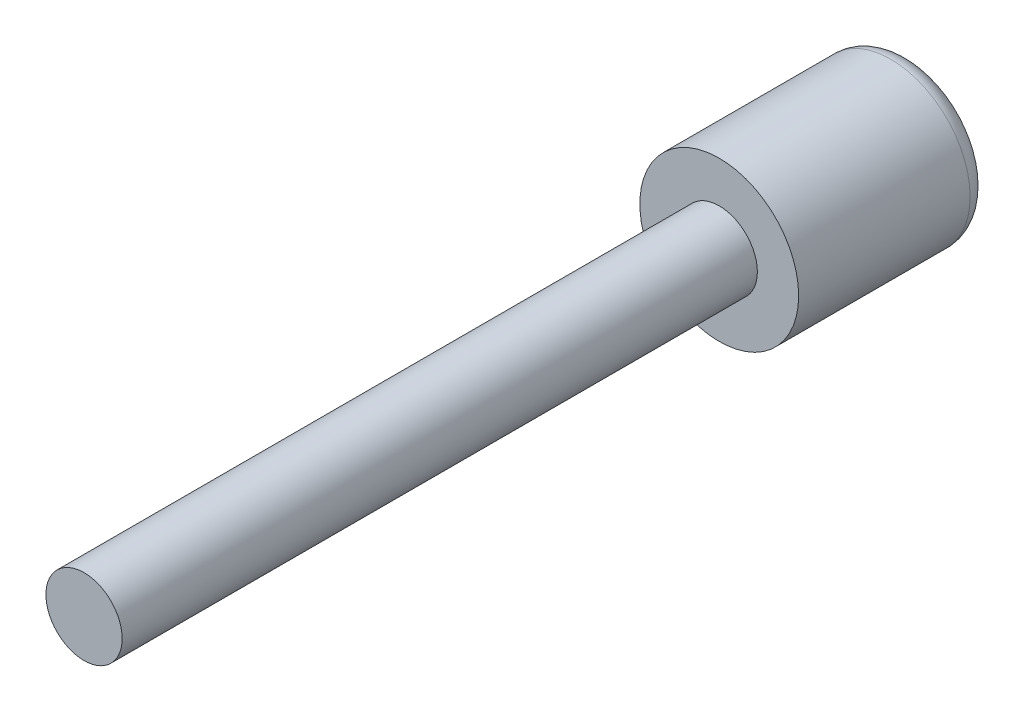
ISO-10303-21;
HEADER;
FILE_DESCRIPTION(('STEP AP214'),'2;1');
FILE_NAME('part.step','',(''),(''),'','','');
FILE_SCHEMA(('AUTOMOTIVE_DESIGN { 1 0 10303 214 1 1 1 1 }'));
ENDSEC;
DATA;
#1=APPLICATION_CONTEXT('core data for automotive mechanical design processes');
#2=APPLICATION_PROTOCOL_DEFINITION('international standard','automotive_design',2000,#1);
#3=PRODUCT_CONTEXT('',#1,'mechanical');
#4=PRODUCT('Part','Part','',(#3));
#5=PRODUCT_RELATED_PRODUCT_CATEGORY('part','',(#4));
#6=PRODUCT_DEFINITION_FORMATION('','',#4);
#7=PRODUCT_DEFINITION_CONTEXT('part definition',#1,'design');
#8=PRODUCT_DEFINITION('design','',#6,#7);
#9=PRODUCT_DEFINITION_SHAPE('','',#8);
#10=(LENGTH_UNIT() NAMED_UNIT(*) SI_UNIT(.MILLI.,.METRE.));
#11=(NAMED_UNIT(*) PLANE_ANGLE_UNIT() SI_UNIT($,.RADIAN.));
#12=(NAMED_UNIT(*) SI_UNIT($,.STERADIAN.) SOLID_ANGLE_UNIT());
#13=UNCERTAINTY_MEASURE_WITH_UNIT(LENGTH_MEASURE(1.E-05),#10,'distance_accuracy_value','');
#14=(GEOMETRIC_REPRESENTATION_CONTEXT(3) GLOBAL_UNCERTAINTY_ASSIGNED_CONTEXT((#13)) GLOBAL_UNIT_ASSIGNED_CONTEXT((#10,
#11,#12)) REPRESENTATION_CONTEXT('',''));
#15=CARTESIAN_POINT('',(0.,0.,0.));
#16=DIRECTION('',(0.,0.,1.));
#17=DIRECTION('',(1.,0.,0.));
#18=AXIS2_PLACEMENT_3D('',#15,#16,#17);
#19=CARTESIAN_POINT('',(0.,0.,3.));
#20=DIRECTION('',(0.,0.,-1.));
#21=DIRECTION('',(-1.,0.,0.));
#22=AXIS2_PLACEMENT_3D('',#19,#20,#21);
#23=CYLINDRICAL_SURFACE('',#22,1.25);
#24=CARTESIAN_POINT('',(0.,0.,0.3));
#25=DIRECTION('',(0.,0.,1.));
#26=DIRECTION('',(1.,0.,0.));
#27=AXIS2_PLACEMENT_3D('',#24,#25,#26);
#28=CIRCLE('',#27,1.25);
#29=CARTESIAN_POINT('',(1.25,0.,0.3));
#30=VERTEX_POINT('',#29);
#31=EDGE_CURVE('E45',#30,#30,#28,.T.);
#32=ORIENTED_EDGE('',*,*,#31,.T.);
#33=EDGE_LOOP('',(#32));
#34=FACE_BOUND('',#33,.T.);
#35=CARTESIAN_POINT('',(0.,0.,3.));
#36=DIRECTION('',(0.,0.,1.));
#37=DIRECTION('',(1.,0.,0.));
#38=AXIS2_PLACEMENT_3D('',#35,#36,#37);
#39=CIRCLE('',#38,1.25);
#40=CARTESIAN_POINT('',(1.25,0.,3.));
#41=VERTEX_POINT('',#40);
#42=EDGE_CURVE('E55',#41,#41,#39,.T.);
#43=ORIENTED_EDGE('',*,*,#42,.F.);
#44=EDGE_LOOP('',(#43));
#45=FACE_BOUND('',#44,.T.);
#46=ADVANCED_FACE('F37',(#34,#45),#23,.T.);
#47=CARTESIAN_POINT('',(0.,0.,3.));
#48=DIRECTION('',(0.,0.,1.));
#49=DIRECTION('',(1.,0.,0.));
#50=AXIS2_PLACEMENT_3D('',#47,#48,#49);
#51=PLANE('',#50);
#52=CARTESIAN_POINT('',(0.,0.,3.));
#53=DIRECTION('',(0.,0.,1.));
#54=DIRECTION('',(1.,0.,0.));
#55=AXIS2_PLACEMENT_3D('',#52,#53,#54);
#56=CIRCLE('',#55,0.6);
#57=CARTESIAN_POINT('',(0.6,0.,3.));
#58=VERTEX_POINT('',#57);
#59=EDGE_CURVE('E50',#58,#58,#56,.T.);
#60=ORIENTED_EDGE('',*,*,#59,.F.);
#61=EDGE_LOOP('',(#60));
#62=FACE_BOUND('',#61,.T.);
#63=ORIENTED_EDGE('',*,*,#42,.T.);
#64=EDGE_LOOP('',(#63));
#65=FACE_BOUND('',#64,.T.);
#66=ADVANCED_FACE('F75',(#62,#65),#51,.T.);
#67=CARTESIAN_POINT('',(0.,0.,0.));
#68=DIRECTION('',(0.,0.,1.));
#69=DIRECTION('',(1.,0.,0.));
#70=AXIS2_PLACEMENT_3D('',#67,#68,#69);
#71=PLANE('',#70);
#72=CARTESIAN_POINT('',(0.,0.,0.));
#73=DIRECTION('',(0.,0.,1.));
#74=DIRECTION('',(1.,0.,0.));
#75=AXIS2_PLACEMENT_3D('',#72,#73,#74);
#76=CIRCLE('',#75,0.95);
#77=CARTESIAN_POINT('',(0.95,0.,0.));
#78=VERTEX_POINT('',#77);
#79=EDGE_CURVE('E10',#78,#78,#76,.F.);
#80=ORIENTED_EDGE('',*,*,#79,.T.);
#81=EDGE_LOOP('',(#80));
#82=FACE_BOUND('',#81,.T.);
#83=ADVANCED_FACE('F71',(#82),#71,.F.);
#84=CARTESIAN_POINT('',(0.,0.,13.));
#85=DIRECTION('',(0.,0.,-1.));
#86=DIRECTION('',(-1.,0.,0.));
#87=AXIS2_PLACEMENT_3D('',#84,#85,#86);
#88=CYLINDRICAL_SURFACE('',#87,0.6);
#89=CARTESIAN_POINT('',(0.,0.,13.));
#90=DIRECTION('',(0.,0.,1.));
#91=DIRECTION('',(1.,0.,0.));
#92=AXIS2_PLACEMENT_3D('',#89,#90,#91);
#93=CIRCLE('',#92,0.6);
#94=CARTESIAN_POINT('',(0.6,0.,13.));
#95=VERTEX_POINT('',#94);
#96=EDGE_CURVE('E60',#95,#95,#93,.T.);
#97=ORIENTED_EDGE('',*,*,#96,.F.);
#98=EDGE_LOOP('',(#97));
#99=FACE_BOUND('',#98,.T.);
#100=ORIENTED_EDGE('',*,*,#59,.T.);
#101=EDGE_LOOP('',(#100));
#102=FACE_BOUND('',#101,.T.);
#103=ADVANCED_FACE('F68',(#99,#102),#88,.T.);
#104=CARTESIAN_POINT('',(0.,0.,13.));
#105=DIRECTION('',(0.,0.,1.));
#106=DIRECTION('',(1.,0.,0.));
#107=AXIS2_PLACEMENT_3D('',#104,#105,#106);
#108=PLANE('',#107);
#109=ORIENTED_EDGE('',*,*,#96,.T.);
#110=EDGE_LOOP('',(#109));
#111=FACE_BOUND('',#110,.T.);
#112=ADVANCED_FACE('F66',(#111),#108,.T.);
#113=CARTESIAN_POINT('',(0.,0.,0.3));
#114=DIRECTION('',(0.,0.,1.));
#115=DIRECTION('',(1.,0.,0.));
#116=AXIS2_PLACEMENT_3D('',#113,#114,#115);
#117=TOROIDAL_SURFACE('',#116,0.95,0.3);
#118=ORIENTED_EDGE('',*,*,#79,.F.);
#119=EDGE_LOOP('',(#118));
#120=FACE_BOUND('',#119,.T.);
#121=ORIENTED_EDGE('',*,*,#31,.F.);
#122=EDGE_LOOP('',(#121));
#123=FACE_BOUND('',#122,.T.);
#124=ADVANCED_FACE('F39',(#120,#123),#117,.T.);
#125=CLOSED_SHELL('',(#46,#66,#83,#103,#112,#124));
#126=MANIFOLD_SOLID_BREP('B2',#125);
#127=ADVANCED_BREP_SHAPE_REPRESENTATION('',(#18,#126),#14);
#128=SHAPE_DEFINITION_REPRESENTATION(#9,#127);
ENDSEC;
END-ISO-10303-21;
